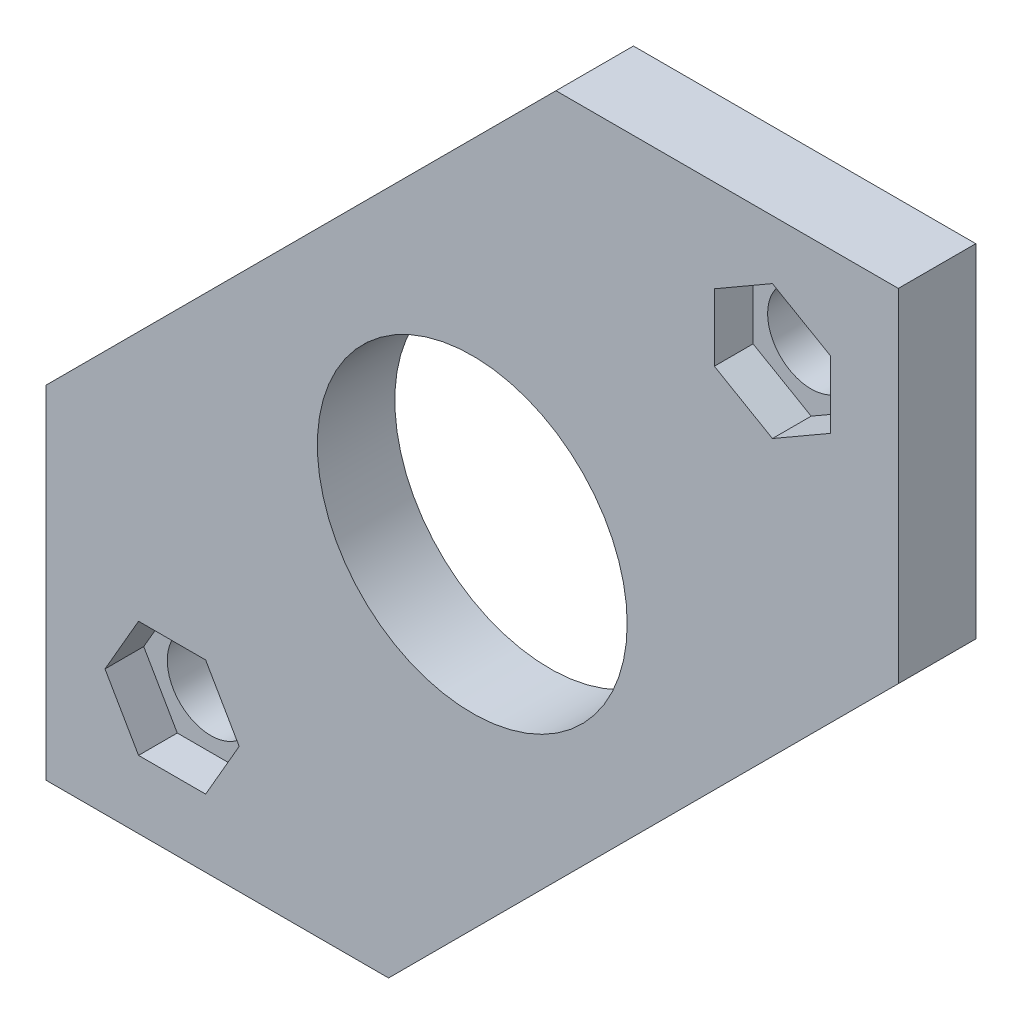
ISO-10303-21;
HEADER;
FILE_DESCRIPTION(('STEP AP214'),'2;1');
FILE_NAME('part.step','',(''),(''),'','','');
FILE_SCHEMA(('AUTOMOTIVE_DESIGN { 1 0 10303 214 1 1 1 1 }'));
ENDSEC;
DATA;
#1=APPLICATION_CONTEXT('core data for automotive mechanical design processes');
#2=APPLICATION_PROTOCOL_DEFINITION('international standard','automotive_design',2000,#1);
#3=PRODUCT_CONTEXT('',#1,'mechanical');
#4=PRODUCT('Part','Part','',(#3));
#5=PRODUCT_RELATED_PRODUCT_CATEGORY('part','',(#4));
#6=PRODUCT_DEFINITION_FORMATION('','',#4);
#7=PRODUCT_DEFINITION_CONTEXT('part definition',#1,'design');
#8=PRODUCT_DEFINITION('design','',#6,#7);
#9=PRODUCT_DEFINITION_SHAPE('','',#8);
#10=(LENGTH_UNIT() NAMED_UNIT(*) SI_UNIT(.MILLI.,.METRE.));
#11=(NAMED_UNIT(*) PLANE_ANGLE_UNIT() SI_UNIT($,.RADIAN.));
#12=(NAMED_UNIT(*) SI_UNIT($,.STERADIAN.) SOLID_ANGLE_UNIT());
#13=UNCERTAINTY_MEASURE_WITH_UNIT(LENGTH_MEASURE(1.E-05),#10,'distance_accuracy_value','');
#14=(GEOMETRIC_REPRESENTATION_CONTEXT(3) GLOBAL_UNCERTAINTY_ASSIGNED_CONTEXT((#13)) GLOBAL_UNIT_ASSIGNED_CONTEXT((#10,
#11,#12)) REPRESENTATION_CONTEXT('',''));
#15=CARTESIAN_POINT('',(0.,0.,0.));
#16=DIRECTION('',(0.,0.,1.));
#17=DIRECTION('',(1.,0.,0.));
#18=AXIS2_PLACEMENT_3D('',#15,#16,#17);
#19=CARTESIAN_POINT('',(-15.5000000000001,-15.4999999999999,4.));
#20=DIRECTION('',(0.,0.,-1.));
#21=DIRECTION('',(-1.,0.,0.));
#22=AXIS2_PLACEMENT_3D('',#19,#20,#21);
#23=CYLINDRICAL_SURFACE('',#22,2.25);
#24=CARTESIAN_POINT('',(-15.5000000000001,-15.4999999999999,0.));
#25=DIRECTION('',(0.,0.,1.));
#26=DIRECTION('',(1.,0.,0.));
#27=AXIS2_PLACEMENT_3D('',#24,#25,#26);
#28=CIRCLE('',#27,2.25);
#29=CARTESIAN_POINT('',(-13.2500000000001,-15.4999999999999,0.));
#30=VERTEX_POINT('',#29);
#31=EDGE_CURVE('E263',#30,#30,#28,.T.);
#32=ORIENTED_EDGE('',*,*,#31,.F.);
#33=EDGE_LOOP('',(#32));
#34=FACE_BOUND('',#33,.T.);
#35=CARTESIAN_POINT('',(-15.5000000000001,-15.4999999999999,2.));
#36=DIRECTION('',(0.,0.,1.));
#37=DIRECTION('',(1.,0.,0.));
#38=AXIS2_PLACEMENT_3D('',#35,#36,#37);
#39=CIRCLE('',#38,2.25);
#40=CARTESIAN_POINT('',(-13.2500000000001,-15.4999999999999,2.));
#41=VERTEX_POINT('',#40);
#42=EDGE_CURVE('E36',#41,#41,#39,.T.);
#43=ORIENTED_EDGE('',*,*,#42,.T.);
#44=EDGE_LOOP('',(#43));
#45=FACE_BOUND('',#44,.T.);
#46=ADVANCED_FACE('F32',(#34,#45),#23,.F.);
#47=CARTESIAN_POINT('',(0.,0.,4.));
#48=DIRECTION('',(0.,0.,-1.));
#49=DIRECTION('',(-1.,0.,0.));
#50=AXIS2_PLACEMENT_3D('',#47,#48,#49);
#51=PLANE('',#50);
#52=DIRECTION('',(0.499999999999999,-0.866025403784439,0.));
#53=VECTOR('',#52,1.);
#54=CARTESIAN_POINT('',(-18.9641016151378,-15.4999999999999,4.));
#55=LINE('',#54,#53);
#56=CARTESIAN_POINT('',(-18.9641016151378,-15.4999999999999,4.));
#57=VERTEX_POINT('',#56);
#58=CARTESIAN_POINT('',(-17.2320508075689,-18.4999999999999,4.));
#59=VERTEX_POINT('',#58);
#60=EDGE_CURVE('E194',#57,#59,#55,.T.);
#61=ORIENTED_EDGE('',*,*,#60,.F.);
#62=DIRECTION('',(-0.499999999999999,-0.866025403784439,0.));
#63=VECTOR('',#62,1.);
#64=CARTESIAN_POINT('',(-17.2320508075689,-12.4999999999999,4.));
#65=LINE('',#64,#63);
#66=CARTESIAN_POINT('',(-17.2320508075689,-12.4999999999999,4.));
#67=VERTEX_POINT('',#66);
#68=EDGE_CURVE('E49',#67,#57,#65,.T.);
#69=ORIENTED_EDGE('',*,*,#68,.F.);
#70=DIRECTION('',(-1.,0.,0.));
#71=VECTOR('',#70,1.);
#72=CARTESIAN_POINT('',(-13.7679491924312,-12.4999999999999,4.));
#73=LINE('',#72,#71);
#74=CARTESIAN_POINT('',(-13.7679491924312,-12.4999999999999,4.));
#75=VERTEX_POINT('',#74);
#76=EDGE_CURVE('E180',#75,#67,#73,.T.);
#77=ORIENTED_EDGE('',*,*,#76,.F.);
#78=DIRECTION('',(-0.5,0.866025403784439,0.));
#79=VECTOR('',#78,1.);
#80=CARTESIAN_POINT('',(-12.0358983848623,-15.4999999999999,4.));
#81=LINE('',#80,#79);
#82=CARTESIAN_POINT('',(-12.0358983848623,-15.4999999999999,4.));
#83=VERTEX_POINT('',#82);
#84=EDGE_CURVE('E183',#83,#75,#81,.T.);
#85=ORIENTED_EDGE('',*,*,#84,.F.);
#86=DIRECTION('',(0.499999999999999,0.866025403784439,0.));
#87=VECTOR('',#86,1.);
#88=CARTESIAN_POINT('',(-13.7679491924312,-18.4999999999999,4.));
#89=LINE('',#88,#87);
#90=CARTESIAN_POINT('',(-13.7679491924312,-18.4999999999999,4.));
#91=VERTEX_POINT('',#90);
#92=EDGE_CURVE('E200',#91,#83,#89,.T.);
#93=ORIENTED_EDGE('',*,*,#92,.F.);
#94=DIRECTION('',(1.,0.,0.));
#95=VECTOR('',#94,1.);
#96=CARTESIAN_POINT('',(-17.2320508075689,-18.4999999999999,4.));
#97=LINE('',#96,#95);
#98=EDGE_CURVE('E197',#59,#91,#97,.T.);
#99=ORIENTED_EDGE('',*,*,#98,.F.);
#100=EDGE_LOOP('',(#61,#69,#77,#85,#93,#99));
#101=FACE_BOUND('',#100,.T.);
#102=DIRECTION('',(0.866025403784439,0.499999999999999,0.));
#103=VECTOR('',#102,1.);
#104=CARTESIAN_POINT('',(18.4999999999999,13.7679491924312,4.));
#105=LINE('',#104,#103);
#106=CARTESIAN_POINT('',(15.4999999999999,12.0358983848623,4.));
#107=VERTEX_POINT('',#106);
#108=CARTESIAN_POINT('',(18.4999999999999,13.7679491924312,4.));
#109=VERTEX_POINT('',#108);
#110=EDGE_CURVE('E236',#107,#109,#105,.T.);
#111=ORIENTED_EDGE('',*,*,#110,.F.);
#112=DIRECTION('',(0.866025403784439,-0.499999999999999,0.));
#113=VECTOR('',#112,1.);
#114=CARTESIAN_POINT('',(15.5,12.0358983848623,4.));
#115=LINE('',#114,#113);
#116=CARTESIAN_POINT('',(12.4999999999999,13.7679491924312,4.));
#117=VERTEX_POINT('',#116);
#118=EDGE_CURVE('E57',#117,#107,#115,.T.);
#119=ORIENTED_EDGE('',*,*,#118,.F.);
#120=DIRECTION('',(0.,-1.,0.));
#121=VECTOR('',#120,1.);
#122=CARTESIAN_POINT('',(12.4999999999999,13.7679491924312,4.));
#123=LINE('',#122,#121);
#124=CARTESIAN_POINT('',(12.4999999999999,17.2320508075689,4.));
#125=VERTEX_POINT('',#124);
#126=EDGE_CURVE('E219',#125,#117,#123,.T.);
#127=ORIENTED_EDGE('',*,*,#126,.F.);
#128=DIRECTION('',(-0.866025403784439,-0.499999999999999,0.));
#129=VECTOR('',#128,1.);
#130=CARTESIAN_POINT('',(12.4999999999999,17.2320508075689,4.));
#131=LINE('',#130,#129);
#132=CARTESIAN_POINT('',(15.5,18.9641016151378,4.));
#133=VERTEX_POINT('',#132);
#134=EDGE_CURVE('E245',#133,#125,#131,.T.);
#135=ORIENTED_EDGE('',*,*,#134,.F.);
#136=DIRECTION('',(-0.866025403784438,0.500000000000001,0.));
#137=VECTOR('',#136,1.);
#138=CARTESIAN_POINT('',(15.5,18.9641016151378,4.));
#139=LINE('',#138,#137);
#140=CARTESIAN_POINT('',(18.4999999999999,17.2320508075689,4.));
#141=VERTEX_POINT('',#140);
#142=EDGE_CURVE('E242',#141,#133,#139,.T.);
#143=ORIENTED_EDGE('',*,*,#142,.F.);
#144=DIRECTION('',(0.,1.,0.));
#145=VECTOR('',#144,1.);
#146=CARTESIAN_POINT('',(18.4999999999999,17.2320508075689,4.));
#147=LINE('',#146,#145);
#148=EDGE_CURVE('E239',#109,#141,#147,.T.);
#149=ORIENTED_EDGE('',*,*,#148,.F.);
#150=EDGE_LOOP('',(#111,#119,#127,#135,#143,#149));
#151=FACE_BOUND('',#150,.T.);
#152=DIRECTION('',(0.707106781186548,0.707106781186547,0.));
#153=VECTOR('',#152,1.);
#154=CARTESIAN_POINT('',(22.,4.3223304703363,4.));
#155=LINE('',#154,#153);
#156=CARTESIAN_POINT('',(-4.3223304703363,-22.,4.));
#157=VERTEX_POINT('',#156);
#158=CARTESIAN_POINT('',(22.,4.3223304703363,4.));
#159=VERTEX_POINT('',#158);
#160=EDGE_CURVE('E273',#157,#159,#155,.T.);
#161=ORIENTED_EDGE('',*,*,#160,.T.);
#162=DIRECTION('',(0.,1.,0.));
#163=VECTOR('',#162,1.);
#164=CARTESIAN_POINT('',(22.,22.,4.));
#165=LINE('',#164,#163);
#166=CARTESIAN_POINT('',(22.,22.,4.));
#167=VERTEX_POINT('',#166);
#168=EDGE_CURVE('E276',#159,#167,#165,.T.);
#169=ORIENTED_EDGE('',*,*,#168,.T.);
#170=DIRECTION('',(-1.,0.,0.));
#171=VECTOR('',#170,1.);
#172=CARTESIAN_POINT('',(4.32233047033631,22.,4.));
#173=LINE('',#172,#171);
#174=CARTESIAN_POINT('',(4.32233047033631,22.,4.));
#175=VERTEX_POINT('',#174);
#176=EDGE_CURVE('E279',#167,#175,#173,.T.);
#177=ORIENTED_EDGE('',*,*,#176,.T.);
#178=DIRECTION('',(-0.707106781186548,-0.707106781186547,0.));
#179=VECTOR('',#178,1.);
#180=CARTESIAN_POINT('',(-22.,-4.3223304703363,4.));
#181=LINE('',#180,#179);
#182=CARTESIAN_POINT('',(-22.,-4.3223304703363,4.));
#183=VERTEX_POINT('',#182);
#184=EDGE_CURVE('E281',#175,#183,#181,.T.);
#185=ORIENTED_EDGE('',*,*,#184,.T.);
#186=DIRECTION('',(0.,-1.,0.));
#187=VECTOR('',#186,1.);
#188=CARTESIAN_POINT('',(-22.,-22.,4.));
#189=LINE('',#188,#187);
#190=CARTESIAN_POINT('',(-22.,-22.,4.));
#191=VERTEX_POINT('',#190);
#192=EDGE_CURVE('E283',#183,#191,#189,.T.);
#193=ORIENTED_EDGE('',*,*,#192,.T.);
#194=DIRECTION('',(1.,0.,0.));
#195=VECTOR('',#194,1.);
#196=CARTESIAN_POINT('',(-4.3223304703363,-22.,4.));
#197=LINE('',#196,#195);
#198=EDGE_CURVE('E285',#191,#157,#197,.T.);
#199=ORIENTED_EDGE('',*,*,#198,.T.);
#200=EDGE_LOOP('',(#161,#169,#177,#185,#193,#199));
#201=FACE_BOUND('',#200,.T.);
#202=CARTESIAN_POINT('',(0.,0.,4.));
#203=DIRECTION('',(0.,0.,1.));
#204=DIRECTION('',(1.,0.,0.));
#205=AXIS2_PLACEMENT_3D('',#202,#203,#204);
#206=CIRCLE('',#205,8.);
#207=CARTESIAN_POINT('',(8.,0.,4.));
#208=VERTEX_POINT('',#207);
#209=EDGE_CURVE('E267',#208,#208,#206,.T.);
#210=ORIENTED_EDGE('',*,*,#209,.F.);
#211=EDGE_LOOP('',(#210));
#212=FACE_BOUND('',#211,.T.);
#213=ADVANCED_FACE('F327',(#101,#151,#201,#212),#51,.F.);
#214=CARTESIAN_POINT('',(0.,0.,0.));
#215=DIRECTION('',(0.,0.,-1.));
#216=DIRECTION('',(-1.,0.,0.));
#217=AXIS2_PLACEMENT_3D('',#214,#215,#216);
#218=PLANE('',#217);
#219=ORIENTED_EDGE('',*,*,#31,.T.);
#220=EDGE_LOOP('',(#219));
#221=FACE_BOUND('',#220,.T.);
#222=DIRECTION('',(0.707106781186548,0.707106781186547,0.));
#223=VECTOR('',#222,1.);
#224=CARTESIAN_POINT('',(22.,4.3223304703363,0.));
#225=LINE('',#224,#223);
#226=CARTESIAN_POINT('',(-4.3223304703363,-22.,0.));
#227=VERTEX_POINT('',#226);
#228=CARTESIAN_POINT('',(22.,4.3223304703363,0.));
#229=VERTEX_POINT('',#228);
#230=EDGE_CURVE('E270',#227,#229,#225,.T.);
#231=ORIENTED_EDGE('',*,*,#230,.F.);
#232=DIRECTION('',(1.,0.,0.));
#233=VECTOR('',#232,1.);
#234=CARTESIAN_POINT('',(-4.3223304703363,-22.,0.));
#235=LINE('',#234,#233);
#236=CARTESIAN_POINT('',(-22.,-22.,0.));
#237=VERTEX_POINT('',#236);
#238=EDGE_CURVE('E277',#237,#227,#235,.T.);
#239=ORIENTED_EDGE('',*,*,#238,.F.);
#240=DIRECTION('',(0.,-1.,0.));
#241=VECTOR('',#240,1.);
#242=CARTESIAN_POINT('',(-22.,-22.,0.));
#243=LINE('',#242,#241);
#244=CARTESIAN_POINT('',(-22.,-4.3223304703363,0.));
#245=VERTEX_POINT('',#244);
#246=EDGE_CURVE('E296',#245,#237,#243,.T.);
#247=ORIENTED_EDGE('',*,*,#246,.F.);
#248=DIRECTION('',(-0.707106781186548,-0.707106781186547,0.));
#249=VECTOR('',#248,1.);
#250=CARTESIAN_POINT('',(-22.,-4.3223304703363,0.));
#251=LINE('',#250,#249);
#252=CARTESIAN_POINT('',(4.32233047033631,22.,0.));
#253=VERTEX_POINT('',#252);
#254=EDGE_CURVE('E294',#253,#245,#251,.T.);
#255=ORIENTED_EDGE('',*,*,#254,.F.);
#256=DIRECTION('',(-1.,0.,0.));
#257=VECTOR('',#256,1.);
#258=CARTESIAN_POINT('',(4.32233047033631,22.,0.));
#259=LINE('',#258,#257);
#260=CARTESIAN_POINT('',(22.,22.,0.));
#261=VERTEX_POINT('',#260);
#262=EDGE_CURVE('E292',#261,#253,#259,.T.);
#263=ORIENTED_EDGE('',*,*,#262,.F.);
#264=DIRECTION('',(0.,1.,0.));
#265=VECTOR('',#264,1.);
#266=CARTESIAN_POINT('',(22.,22.,0.));
#267=LINE('',#266,#265);
#268=EDGE_CURVE('E290',#229,#261,#267,.T.);
#269=ORIENTED_EDGE('',*,*,#268,.F.);
#270=EDGE_LOOP('',(#231,#239,#247,#255,#263,#269));
#271=FACE_BOUND('',#270,.T.);
#272=CARTESIAN_POINT('',(0.,0.,0.));
#273=DIRECTION('',(0.,0.,1.));
#274=DIRECTION('',(1.,0.,0.));
#275=AXIS2_PLACEMENT_3D('',#272,#273,#274);
#276=CIRCLE('',#275,8.);
#277=CARTESIAN_POINT('',(8.,0.,0.));
#278=VERTEX_POINT('',#277);
#279=EDGE_CURVE('E266',#278,#278,#276,.T.);
#280=ORIENTED_EDGE('',*,*,#279,.T.);
#281=EDGE_LOOP('',(#280));
#282=FACE_BOUND('',#281,.T.);
#283=CARTESIAN_POINT('',(15.5000000000002,15.4999999999998,0.));
#284=DIRECTION('',(0.,0.,1.));
#285=DIRECTION('',(1.,0.,0.));
#286=AXIS2_PLACEMENT_3D('',#283,#284,#285);
#287=CIRCLE('',#286,2.25);
#288=CARTESIAN_POINT('',(17.7500000000002,15.4999999999998,0.));
#289=VERTEX_POINT('',#288);
#290=EDGE_CURVE('E260',#289,#289,#287,.T.);
#291=ORIENTED_EDGE('',*,*,#290,.T.);
#292=EDGE_LOOP('',(#291));
#293=FACE_BOUND('',#292,.T.);
#294=ADVANCED_FACE('F333',(#221,#271,#282,#293),#218,.T.);
#295=CARTESIAN_POINT('',(22.,4.3223304703363,4.));
#296=DIRECTION('',(-0.707106781186547,0.707106781186548,0.));
#297=DIRECTION('',(-0.707106781186548,-0.707106781186547,0.));
#298=AXIS2_PLACEMENT_3D('',#295,#296,#297);
#299=PLANE('',#298);
#300=ORIENTED_EDGE('',*,*,#230,.T.);
#301=DIRECTION('',(0.,0.,-1.));
#302=VECTOR('',#301,1.);
#303=CARTESIAN_POINT('',(22.,4.3223304703363,4.));
#304=LINE('',#303,#302);
#305=EDGE_CURVE('E11',#159,#229,#304,.T.);
#306=ORIENTED_EDGE('',*,*,#305,.F.);
#307=ORIENTED_EDGE('',*,*,#160,.F.);
#308=DIRECTION('',(0.,0.,-1.));
#309=VECTOR('',#308,1.);
#310=CARTESIAN_POINT('',(-4.3223304703363,-22.,4.));
#311=LINE('',#310,#309);
#312=EDGE_CURVE('E287',#157,#227,#311,.T.);
#313=ORIENTED_EDGE('',*,*,#312,.T.);
#314=EDGE_LOOP('',(#300,#306,#307,#313));
#315=FACE_BOUND('',#314,.T.);
#316=ADVANCED_FACE('F34',(#315),#299,.F.);
#317=CARTESIAN_POINT('',(22.,22.,4.));
#318=DIRECTION('',(-1.,0.,0.));
#319=DIRECTION('',(0.,0.,1.));
#320=AXIS2_PLACEMENT_3D('',#317,#318,#319);
#321=PLANE('',#320);
#322=ORIENTED_EDGE('',*,*,#268,.T.);
#323=DIRECTION('',(0.,0.,-1.));
#324=VECTOR('',#323,1.);
#325=CARTESIAN_POINT('',(22.,22.,4.));
#326=LINE('',#325,#324);
#327=EDGE_CURVE('E41',#167,#261,#326,.T.);
#328=ORIENTED_EDGE('',*,*,#327,.F.);
#329=ORIENTED_EDGE('',*,*,#168,.F.);
#330=ORIENTED_EDGE('',*,*,#305,.T.);
#331=EDGE_LOOP('',(#322,#328,#329,#330));
#332=FACE_BOUND('',#331,.T.);
#333=ADVANCED_FACE('F362',(#332),#321,.F.);
#334=CARTESIAN_POINT('',(4.32233047033631,22.,4.));
#335=DIRECTION('',(0.,-1.,0.));
#336=DIRECTION('',(0.,0.,-1.));
#337=AXIS2_PLACEMENT_3D('',#334,#335,#336);
#338=PLANE('',#337);
#339=ORIENTED_EDGE('',*,*,#262,.T.);
#340=DIRECTION('',(0.,0.,-1.));
#341=VECTOR('',#340,1.);
#342=CARTESIAN_POINT('',(4.32233047033631,22.,4.));
#343=LINE('',#342,#341);
#344=EDGE_CURVE('E307',#175,#253,#343,.T.);
#345=ORIENTED_EDGE('',*,*,#344,.F.);
#346=ORIENTED_EDGE('',*,*,#176,.F.);
#347=ORIENTED_EDGE('',*,*,#327,.T.);
#348=EDGE_LOOP('',(#339,#345,#346,#347));
#349=FACE_BOUND('',#348,.T.);
#350=ADVANCED_FACE('F359',(#349),#338,.F.);
#351=CARTESIAN_POINT('',(-22.,-4.3223304703363,4.));
#352=DIRECTION('',(0.707106781186547,-0.707106781186548,0.));
#353=DIRECTION('',(0.707106781186548,0.707106781186547,0.));
#354=AXIS2_PLACEMENT_3D('',#351,#352,#353);
#355=PLANE('',#354);
#356=ORIENTED_EDGE('',*,*,#254,.T.);
#357=DIRECTION('',(0.,0.,-1.));
#358=VECTOR('',#357,1.);
#359=CARTESIAN_POINT('',(-22.,-4.3223304703363,4.));
#360=LINE('',#359,#358);
#361=EDGE_CURVE('E304',#183,#245,#360,.T.);
#362=ORIENTED_EDGE('',*,*,#361,.F.);
#363=ORIENTED_EDGE('',*,*,#184,.F.);
#364=ORIENTED_EDGE('',*,*,#344,.T.);
#365=EDGE_LOOP('',(#356,#362,#363,#364));
#366=FACE_BOUND('',#365,.T.);
#367=ADVANCED_FACE('F355',(#366),#355,.F.);
#368=CARTESIAN_POINT('',(-22.,-22.,4.));
#369=DIRECTION('',(1.,0.,0.));
#370=DIRECTION('',(0.,1.,0.));
#371=AXIS2_PLACEMENT_3D('',#368,#369,#370);
#372=PLANE('',#371);
#373=ORIENTED_EDGE('',*,*,#246,.T.);
#374=DIRECTION('',(0.,0.,-1.));
#375=VECTOR('',#374,1.);
#376=CARTESIAN_POINT('',(-22.,-22.,4.));
#377=LINE('',#376,#375);
#378=EDGE_CURVE('E301',#191,#237,#377,.T.);
#379=ORIENTED_EDGE('',*,*,#378,.F.);
#380=ORIENTED_EDGE('',*,*,#192,.F.);
#381=ORIENTED_EDGE('',*,*,#361,.T.);
#382=EDGE_LOOP('',(#373,#379,#380,#381));
#383=FACE_BOUND('',#382,.T.);
#384=ADVANCED_FACE('F351',(#383),#372,.F.);
#385=CARTESIAN_POINT('',(-4.3223304703363,-22.,4.));
#386=DIRECTION('',(0.,1.,0.));
#387=DIRECTION('',(0.,0.,1.));
#388=AXIS2_PLACEMENT_3D('',#385,#386,#387);
#389=PLANE('',#388);
#390=ORIENTED_EDGE('',*,*,#238,.T.);
#391=ORIENTED_EDGE('',*,*,#312,.F.);
#392=ORIENTED_EDGE('',*,*,#198,.F.);
#393=ORIENTED_EDGE('',*,*,#378,.T.);
#394=EDGE_LOOP('',(#390,#391,#392,#393));
#395=FACE_BOUND('',#394,.T.);
#396=ADVANCED_FACE('F343',(#395),#389,.F.);
#397=CARTESIAN_POINT('',(0.,0.,4.));
#398=DIRECTION('',(0.,0.,-1.));
#399=DIRECTION('',(-1.,0.,0.));
#400=AXIS2_PLACEMENT_3D('',#397,#398,#399);
#401=CYLINDRICAL_SURFACE('',#400,8.);
#402=ORIENTED_EDGE('',*,*,#209,.T.);
#403=EDGE_LOOP('',(#402));
#404=FACE_BOUND('',#403,.T.);
#405=ORIENTED_EDGE('',*,*,#279,.F.);
#406=EDGE_LOOP('',(#405));
#407=FACE_BOUND('',#406,.T.);
#408=ADVANCED_FACE('F341',(#404,#407),#401,.F.);
#409=CARTESIAN_POINT('',(15.5000000000002,15.4999999999998,4.));
#410=DIRECTION('',(0.,0.,-1.));
#411=DIRECTION('',(-1.,0.,0.));
#412=AXIS2_PLACEMENT_3D('',#409,#410,#411);
#413=CYLINDRICAL_SURFACE('',#412,2.25);
#414=CARTESIAN_POINT('',(15.5000000000002,15.4999999999998,2.));
#415=DIRECTION('',(0.,0.,-1.));
#416=DIRECTION('',(-1.,0.,0.));
#417=AXIS2_PLACEMENT_3D('',#414,#415,#416);
#418=CIRCLE('',#417,2.25);
#419=CARTESIAN_POINT('',(13.2500000000002,15.4999999999998,2.));
#420=VERTEX_POINT('',#419);
#421=EDGE_CURVE('E207',#420,#420,#418,.T.);
#422=ORIENTED_EDGE('',*,*,#421,.F.);
#423=EDGE_LOOP('',(#422));
#424=FACE_BOUND('',#423,.T.);
#425=ORIENTED_EDGE('',*,*,#290,.F.);
#426=EDGE_LOOP('',(#425));
#427=FACE_BOUND('',#426,.T.);
#428=ADVANCED_FACE('F339',(#424,#427),#413,.F.);
#429=CARTESIAN_POINT('',(15.5,12.0358983848623,2.));
#430=DIRECTION('',(-0.5,-0.866025403784439,0.));
#431=DIRECTION('',(0.866025403784439,-0.499999999999999,0.));
#432=AXIS2_PLACEMENT_3D('',#429,#430,#431);
#433=PLANE('',#432);
#434=ORIENTED_EDGE('',*,*,#118,.T.);
#435=DIRECTION('',(0.,0.,1.));
#436=VECTOR('',#435,1.);
#437=CARTESIAN_POINT('',(15.5,12.0358983848623,2.));
#438=LINE('',#437,#436);
#439=CARTESIAN_POINT('',(15.5,12.0358983848623,2.));
#440=VERTEX_POINT('',#439);
#441=EDGE_CURVE('E234',#440,#107,#438,.T.);
#442=ORIENTED_EDGE('',*,*,#441,.F.);
#443=DIRECTION('',(0.866025403784439,-0.499999999999999,0.));
#444=VECTOR('',#443,1.);
#445=CARTESIAN_POINT('',(15.5,12.0358983848623,2.));
#446=LINE('',#445,#444);
#447=CARTESIAN_POINT('',(12.4999999999999,13.7679491924312,2.));
#448=VERTEX_POINT('',#447);
#449=EDGE_CURVE('E215',#448,#440,#446,.T.);
#450=ORIENTED_EDGE('',*,*,#449,.F.);
#451=DIRECTION('',(0.,0.,1.));
#452=VECTOR('',#451,1.);
#453=CARTESIAN_POINT('',(12.4999999999999,13.7679491924312,2.));
#454=LINE('',#453,#452);
#455=EDGE_CURVE('E195',#448,#117,#454,.T.);
#456=ORIENTED_EDGE('',*,*,#455,.T.);
#457=EDGE_LOOP('',(#434,#442,#450,#456));
#458=FACE_BOUND('',#457,.T.);
#459=ADVANCED_FACE('F397',(#458),#433,.F.);
#460=CARTESIAN_POINT('',(12.4999999999999,13.7679491924312,2.));
#461=DIRECTION('',(-1.,0.,0.));
#462=DIRECTION('',(0.,0.,1.));
#463=AXIS2_PLACEMENT_3D('',#460,#461,#462);
#464=PLANE('',#463);
#465=ORIENTED_EDGE('',*,*,#126,.T.);
#466=ORIENTED_EDGE('',*,*,#455,.F.);
#467=DIRECTION('',(0.,-1.,0.));
#468=VECTOR('',#467,1.);
#469=CARTESIAN_POINT('',(12.4999999999999,13.7679491924312,2.));
#470=LINE('',#469,#468);
#471=CARTESIAN_POINT('',(12.4999999999999,17.2320508075689,2.));
#472=VERTEX_POINT('',#471);
#473=EDGE_CURVE('E231',#472,#448,#470,.T.);
#474=ORIENTED_EDGE('',*,*,#473,.F.);
#475=DIRECTION('',(0.,0.,1.));
#476=VECTOR('',#475,1.);
#477=CARTESIAN_POINT('',(12.4999999999999,17.2320508075689,2.));
#478=LINE('',#477,#476);
#479=EDGE_CURVE('E251',#472,#125,#478,.T.);
#480=ORIENTED_EDGE('',*,*,#479,.T.);
#481=EDGE_LOOP('',(#465,#466,#474,#480));
#482=FACE_BOUND('',#481,.T.);
#483=ADVANCED_FACE('F402',(#482),#464,.F.);
#484=CARTESIAN_POINT('',(12.4999999999999,17.2320508075689,2.));
#485=DIRECTION('',(-0.499999999999999,0.866025403784439,0.));
#486=DIRECTION('',(-0.866025403784439,-0.499999999999999,0.));
#487=AXIS2_PLACEMENT_3D('',#484,#485,#486);
#488=PLANE('',#487);
#489=ORIENTED_EDGE('',*,*,#134,.T.);
#490=ORIENTED_EDGE('',*,*,#479,.F.);
#491=DIRECTION('',(-0.866025403784439,-0.499999999999999,0.));
#492=VECTOR('',#491,1.);
#493=CARTESIAN_POINT('',(12.4999999999999,17.2320508075689,2.));
#494=LINE('',#493,#492);
#495=CARTESIAN_POINT('',(15.5,18.9641016151378,2.));
#496=VERTEX_POINT('',#495);
#497=EDGE_CURVE('E228',#496,#472,#494,.T.);
#498=ORIENTED_EDGE('',*,*,#497,.F.);
#499=DIRECTION('',(0.,0.,1.));
#500=VECTOR('',#499,1.);
#501=CARTESIAN_POINT('',(15.5,18.9641016151378,2.));
#502=LINE('',#501,#500);
#503=EDGE_CURVE('E253',#496,#133,#502,.T.);
#504=ORIENTED_EDGE('',*,*,#503,.T.);
#505=EDGE_LOOP('',(#489,#490,#498,#504));
#506=FACE_BOUND('',#505,.T.);
#507=ADVANCED_FACE('F406',(#506),#488,.F.);
#508=CARTESIAN_POINT('',(15.5,18.9641016151378,2.));
#509=DIRECTION('',(0.500000000000001,0.866025403784438,0.));
#510=DIRECTION('',(-0.866025403784438,0.500000000000001,0.));
#511=AXIS2_PLACEMENT_3D('',#508,#509,#510);
#512=PLANE('',#511);
#513=ORIENTED_EDGE('',*,*,#142,.T.);
#514=ORIENTED_EDGE('',*,*,#503,.F.);
#515=DIRECTION('',(-0.866025403784438,0.500000000000001,0.));
#516=VECTOR('',#515,1.);
#517=CARTESIAN_POINT('',(15.5,18.9641016151378,2.));
#518=LINE('',#517,#516);
#519=CARTESIAN_POINT('',(18.4999999999999,17.2320508075689,2.));
#520=VERTEX_POINT('',#519);
#521=EDGE_CURVE('E225',#520,#496,#518,.T.);
#522=ORIENTED_EDGE('',*,*,#521,.F.);
#523=DIRECTION('',(0.,0.,1.));
#524=VECTOR('',#523,1.);
#525=CARTESIAN_POINT('',(18.4999999999999,17.2320508075689,2.));
#526=LINE('',#525,#524);
#527=EDGE_CURVE('E255',#520,#141,#526,.T.);
#528=ORIENTED_EDGE('',*,*,#527,.T.);
#529=EDGE_LOOP('',(#513,#514,#522,#528));
#530=FACE_BOUND('',#529,.T.);
#531=ADVANCED_FACE('F418',(#530),#512,.F.);
#532=CARTESIAN_POINT('',(18.4999999999999,17.2320508075689,2.));
#533=DIRECTION('',(1.,0.,0.));
#534=DIRECTION('',(0.,1.,0.));
#535=AXIS2_PLACEMENT_3D('',#532,#533,#534);
#536=PLANE('',#535);
#537=ORIENTED_EDGE('',*,*,#148,.T.);
#538=ORIENTED_EDGE('',*,*,#527,.F.);
#539=DIRECTION('',(0.,1.,0.));
#540=VECTOR('',#539,1.);
#541=CARTESIAN_POINT('',(18.4999999999999,17.2320508075689,2.));
#542=LINE('',#541,#540);
#543=CARTESIAN_POINT('',(18.4999999999999,13.7679491924312,2.));
#544=VERTEX_POINT('',#543);
#545=EDGE_CURVE('E222',#544,#520,#542,.T.);
#546=ORIENTED_EDGE('',*,*,#545,.F.);
#547=DIRECTION('',(0.,0.,1.));
#548=VECTOR('',#547,1.);
#549=CARTESIAN_POINT('',(18.4999999999999,13.7679491924312,2.));
#550=LINE('',#549,#548);
#551=EDGE_CURVE('E257',#544,#109,#550,.T.);
#552=ORIENTED_EDGE('',*,*,#551,.T.);
#553=EDGE_LOOP('',(#537,#538,#546,#552));
#554=FACE_BOUND('',#553,.T.);
#555=ADVANCED_FACE('F414',(#554),#536,.F.);
#556=CARTESIAN_POINT('',(18.4999999999999,13.7679491924312,2.));
#557=DIRECTION('',(0.499999999999999,-0.866025403784439,0.));
#558=DIRECTION('',(0.866025403784439,0.499999999999999,0.));
#559=AXIS2_PLACEMENT_3D('',#556,#557,#558);
#560=PLANE('',#559);
#561=ORIENTED_EDGE('',*,*,#110,.T.);
#562=ORIENTED_EDGE('',*,*,#551,.F.);
#563=DIRECTION('',(0.866025403784439,0.499999999999999,0.));
#564=VECTOR('',#563,1.);
#565=CARTESIAN_POINT('',(18.4999999999999,13.7679491924312,2.));
#566=LINE('',#565,#564);
#567=EDGE_CURVE('E218',#440,#544,#566,.T.);
#568=ORIENTED_EDGE('',*,*,#567,.F.);
#569=ORIENTED_EDGE('',*,*,#441,.T.);
#570=EDGE_LOOP('',(#561,#562,#568,#569));
#571=FACE_BOUND('',#570,.T.);
#572=ADVANCED_FACE('F410',(#571),#560,.F.);
#573=CARTESIAN_POINT('',(0.,0.,2.));
#574=DIRECTION('',(0.,0.,-1.));
#575=DIRECTION('',(-1.,0.,0.));
#576=AXIS2_PLACEMENT_3D('',#573,#574,#575);
#577=PLANE('',#576);
#578=ORIENTED_EDGE('',*,*,#421,.T.);
#579=EDGE_LOOP('',(#578));
#580=FACE_BOUND('',#579,.T.);
#581=ORIENTED_EDGE('',*,*,#449,.T.);
#582=ORIENTED_EDGE('',*,*,#567,.T.);
#583=ORIENTED_EDGE('',*,*,#545,.T.);
#584=ORIENTED_EDGE('',*,*,#521,.T.);
#585=ORIENTED_EDGE('',*,*,#497,.T.);
#586=ORIENTED_EDGE('',*,*,#473,.T.);
#587=EDGE_LOOP('',(#581,#582,#583,#584,#585,#586));
#588=FACE_BOUND('',#587,.T.);
#589=ADVANCED_FACE('F413',(#580,#588),#577,.F.);
#590=CARTESIAN_POINT('',(-17.2320508075689,-12.4999999999999,2.));
#591=DIRECTION('',(-0.866025403784439,0.499999999999999,0.));
#592=DIRECTION('',(-0.5,-0.866025403784439,0.));
#593=AXIS2_PLACEMENT_3D('',#590,#591,#592);
#594=PLANE('',#593);
#595=ORIENTED_EDGE('',*,*,#68,.T.);
#596=DIRECTION('',(0.,0.,1.));
#597=VECTOR('',#596,1.);
#598=CARTESIAN_POINT('',(-18.9641016151378,-15.4999999999999,2.));
#599=LINE('',#598,#597);
#600=CARTESIAN_POINT('',(-18.9641016151378,-15.4999999999999,2.));
#601=VERTEX_POINT('',#600);
#602=EDGE_CURVE('E157',#601,#57,#599,.T.);
#603=ORIENTED_EDGE('',*,*,#602,.F.);
#604=DIRECTION('',(-0.499999999999999,-0.866025403784439,0.));
#605=VECTOR('',#604,1.);
#606=CARTESIAN_POINT('',(-17.2320508075689,-12.4999999999999,2.));
#607=LINE('',#606,#605);
#608=CARTESIAN_POINT('',(-17.2320508075689,-12.4999999999999,2.));
#609=VERTEX_POINT('',#608);
#610=EDGE_CURVE('E161',#609,#601,#607,.T.);
#611=ORIENTED_EDGE('',*,*,#610,.F.);
#612=DIRECTION('',(0.,0.,1.));
#613=VECTOR('',#612,1.);
#614=CARTESIAN_POINT('',(-17.2320508075689,-12.4999999999999,2.));
#615=LINE('',#614,#613);
#616=EDGE_CURVE('E205',#609,#67,#615,.T.);
#617=ORIENTED_EDGE('',*,*,#616,.T.);
#618=EDGE_LOOP('',(#595,#603,#611,#617));
#619=FACE_BOUND('',#618,.T.);
#620=ADVANCED_FACE('F159',(#619),#594,.F.);
#621=CARTESIAN_POINT('',(-13.7679491924312,-12.4999999999999,2.));
#622=DIRECTION('',(0.,1.,0.));
#623=DIRECTION('',(0.,0.,1.));
#624=AXIS2_PLACEMENT_3D('',#621,#622,#623);
#625=PLANE('',#624);
#626=ORIENTED_EDGE('',*,*,#76,.T.);
#627=ORIENTED_EDGE('',*,*,#616,.F.);
#628=DIRECTION('',(-1.,0.,0.));
#629=VECTOR('',#628,1.);
#630=CARTESIAN_POINT('',(-13.7679491924312,-12.4999999999999,2.));
#631=LINE('',#630,#629);
#632=CARTESIAN_POINT('',(-13.7679491924312,-12.4999999999999,2.));
#633=VERTEX_POINT('',#632);
#634=EDGE_CURVE('E167',#633,#609,#631,.T.);
#635=ORIENTED_EDGE('',*,*,#634,.F.);
#636=DIRECTION('',(0.,0.,1.));
#637=VECTOR('',#636,1.);
#638=CARTESIAN_POINT('',(-13.7679491924312,-12.4999999999999,2.));
#639=LINE('',#638,#637);
#640=EDGE_CURVE('E208',#633,#75,#639,.T.);
#641=ORIENTED_EDGE('',*,*,#640,.T.);
#642=EDGE_LOOP('',(#626,#627,#635,#641));
#643=FACE_BOUND('',#642,.T.);
#644=ADVANCED_FACE('F429',(#643),#625,.F.);
#645=CARTESIAN_POINT('',(-12.0358983848623,-15.4999999999999,2.));
#646=DIRECTION('',(0.866025403784439,0.5,0.));
#647=DIRECTION('',(-0.5,0.866025403784439,0.));
#648=AXIS2_PLACEMENT_3D('',#645,#646,#647);
#649=PLANE('',#648);
#650=ORIENTED_EDGE('',*,*,#84,.T.);
#651=ORIENTED_EDGE('',*,*,#640,.F.);
#652=DIRECTION('',(-0.5,0.866025403784439,0.));
#653=VECTOR('',#652,1.);
#654=CARTESIAN_POINT('',(-12.0358983848623,-15.4999999999999,2.));
#655=LINE('',#654,#653);
#656=CARTESIAN_POINT('',(-12.0358983848623,-15.4999999999999,2.));
#657=VERTEX_POINT('',#656);
#658=EDGE_CURVE('E190',#657,#633,#655,.T.);
#659=ORIENTED_EDGE('',*,*,#658,.F.);
#660=DIRECTION('',(0.,0.,1.));
#661=VECTOR('',#660,1.);
#662=CARTESIAN_POINT('',(-12.0358983848623,-15.4999999999999,2.));
#663=LINE('',#662,#661);
#664=EDGE_CURVE('E210',#657,#83,#663,.T.);
#665=ORIENTED_EDGE('',*,*,#664,.T.);
#666=EDGE_LOOP('',(#650,#651,#659,#665));
#667=FACE_BOUND('',#666,.T.);
#668=ADVANCED_FACE('F437',(#667),#649,.F.);
#669=CARTESIAN_POINT('',(-13.7679491924312,-18.4999999999999,2.));
#670=DIRECTION('',(0.866025403784439,-0.499999999999999,0.));
#671=DIRECTION('',(0.499999999999999,0.866025403784439,0.));
#672=AXIS2_PLACEMENT_3D('',#669,#670,#671);
#673=PLANE('',#672);
#674=ORIENTED_EDGE('',*,*,#92,.T.);
#675=ORIENTED_EDGE('',*,*,#664,.F.);
#676=DIRECTION('',(0.499999999999999,0.866025403784439,0.));
#677=VECTOR('',#676,1.);
#678=CARTESIAN_POINT('',(-13.7679491924312,-18.4999999999999,2.));
#679=LINE('',#678,#677);
#680=CARTESIAN_POINT('',(-13.7679491924312,-18.4999999999999,2.));
#681=VERTEX_POINT('',#680);
#682=EDGE_CURVE('E187',#681,#657,#679,.T.);
#683=ORIENTED_EDGE('',*,*,#682,.F.);
#684=DIRECTION('',(0.,0.,1.));
#685=VECTOR('',#684,1.);
#686=CARTESIAN_POINT('',(-13.7679491924312,-18.4999999999999,2.));
#687=LINE('',#686,#685);
#688=EDGE_CURVE('E212',#681,#91,#687,.T.);
#689=ORIENTED_EDGE('',*,*,#688,.T.);
#690=EDGE_LOOP('',(#674,#675,#683,#689));
#691=FACE_BOUND('',#690,.T.);
#692=ADVANCED_FACE('F433',(#691),#673,.F.);
#693=CARTESIAN_POINT('',(-17.2320508075689,-18.4999999999999,2.));
#694=DIRECTION('',(0.,-1.,0.));
#695=DIRECTION('',(1.,0.,0.));
#696=AXIS2_PLACEMENT_3D('',#693,#694,#695);
#697=PLANE('',#696);
#698=ORIENTED_EDGE('',*,*,#98,.T.);
#699=ORIENTED_EDGE('',*,*,#688,.F.);
#700=DIRECTION('',(1.,0.,0.));
#701=VECTOR('',#700,1.);
#702=CARTESIAN_POINT('',(-17.2320508075689,-18.4999999999999,2.));
#703=LINE('',#702,#701);
#704=CARTESIAN_POINT('',(-17.2320508075689,-18.4999999999999,2.));
#705=VERTEX_POINT('',#704);
#706=EDGE_CURVE('E175',#705,#681,#703,.T.);
#707=ORIENTED_EDGE('',*,*,#706,.F.);
#708=DIRECTION('',(0.,0.,1.));
#709=VECTOR('',#708,1.);
#710=CARTESIAN_POINT('',(-17.2320508075689,-18.4999999999999,2.));
#711=LINE('',#710,#709);
#712=EDGE_CURVE('E166',#705,#59,#711,.T.);
#713=ORIENTED_EDGE('',*,*,#712,.T.);
#714=EDGE_LOOP('',(#698,#699,#707,#713));
#715=FACE_BOUND('',#714,.T.);
#716=ADVANCED_FACE('F323',(#715),#697,.F.);
#717=CARTESIAN_POINT('',(-18.9641016151378,-15.4999999999999,2.));
#718=DIRECTION('',(-0.866025403784439,-0.499999999999999,0.));
#719=DIRECTION('',(0.5,-0.866025403784439,0.));
#720=AXIS2_PLACEMENT_3D('',#717,#718,#719);
#721=PLANE('',#720);
#722=ORIENTED_EDGE('',*,*,#60,.T.);
#723=ORIENTED_EDGE('',*,*,#712,.F.);
#724=DIRECTION('',(0.499999999999999,-0.866025403784439,0.));
#725=VECTOR('',#724,1.);
#726=CARTESIAN_POINT('',(-18.9641016151378,-15.4999999999999,2.));
#727=LINE('',#726,#725);
#728=EDGE_CURVE('E170',#601,#705,#727,.T.);
#729=ORIENTED_EDGE('',*,*,#728,.F.);
#730=ORIENTED_EDGE('',*,*,#602,.T.);
#731=EDGE_LOOP('',(#722,#723,#729,#730));
#732=FACE_BOUND('',#731,.T.);
#733=ADVANCED_FACE('F171',(#732),#721,.F.);
#734=CARTESIAN_POINT('',(0.,0.,2.));
#735=DIRECTION('',(0.,0.,1.));
#736=DIRECTION('',(1.,0.,0.));
#737=AXIS2_PLACEMENT_3D('',#734,#735,#736);
#738=PLANE('',#737);
#739=ORIENTED_EDGE('',*,*,#42,.F.);
#740=EDGE_LOOP('',(#739));
#741=FACE_BOUND('',#740,.T.);
#742=ORIENTED_EDGE('',*,*,#610,.T.);
#743=ORIENTED_EDGE('',*,*,#728,.T.);
#744=ORIENTED_EDGE('',*,*,#706,.T.);
#745=ORIENTED_EDGE('',*,*,#682,.T.);
#746=ORIENTED_EDGE('',*,*,#658,.T.);
#747=ORIENTED_EDGE('',*,*,#634,.T.);
#748=EDGE_LOOP('',(#742,#743,#744,#745,#746,#747));
#749=FACE_BOUND('',#748,.T.);
#750=ADVANCED_FACE('F177',(#741,#749),#738,.T.);
#751=CLOSED_SHELL('',(#46,#213,#294,#316,#333,#350,#367,#384,#396,#408,#428,#459,#483,#507,#531,
#555,#572,#589,#620,#644,#668,#692,#716,#733,#750));
#752=MANIFOLD_SOLID_BREP('B2',#751);
#753=ADVANCED_BREP_SHAPE_REPRESENTATION('',(#18,#752),#14);
#754=SHAPE_DEFINITION_REPRESENTATION(#9,#753);
ENDSEC;
END-ISO-10303-21;
